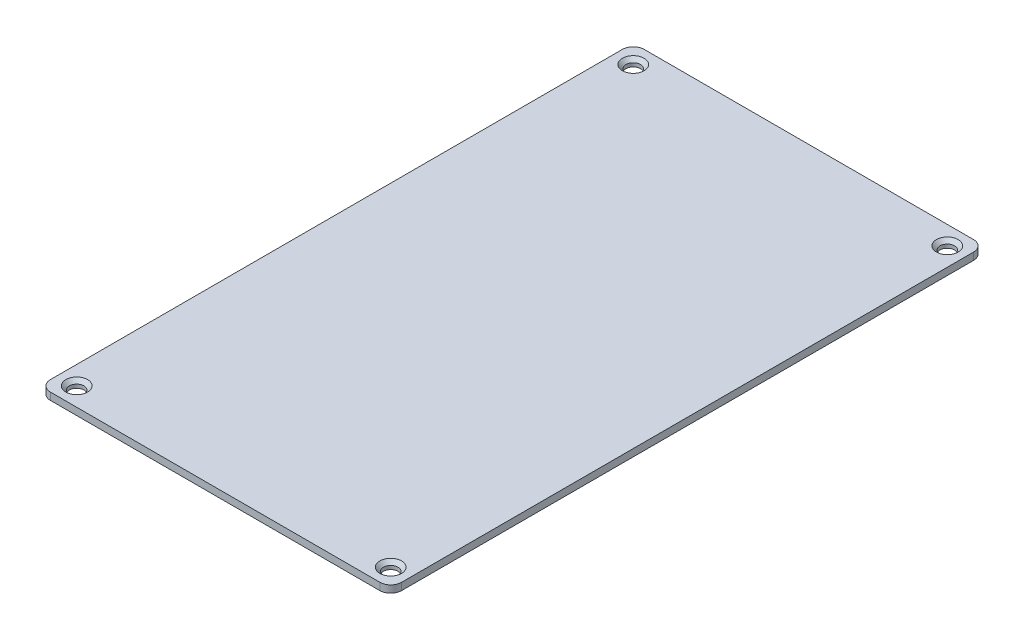
ISO-10303-21;
HEADER;
FILE_DESCRIPTION(('STEP AP214'),'2;1');
FILE_NAME('part.step','',(''),(''),'','','');
FILE_SCHEMA(('AUTOMOTIVE_DESIGN { 1 0 10303 214 1 1 1 1 }'));
ENDSEC;
DATA;
#1=APPLICATION_CONTEXT('core data for automotive mechanical design processes');
#2=APPLICATION_PROTOCOL_DEFINITION('international standard','automotive_design',2000,#1);
#3=PRODUCT_CONTEXT('',#1,'mechanical');
#4=PRODUCT('Part','Part','',(#3));
#5=PRODUCT_RELATED_PRODUCT_CATEGORY('part','',(#4));
#6=PRODUCT_DEFINITION_FORMATION('','',#4);
#7=PRODUCT_DEFINITION_CONTEXT('part definition',#1,'design');
#8=PRODUCT_DEFINITION('design','',#6,#7);
#9=PRODUCT_DEFINITION_SHAPE('','',#8);
#10=(LENGTH_UNIT() NAMED_UNIT(*) SI_UNIT(.MILLI.,.METRE.));
#11=(NAMED_UNIT(*) PLANE_ANGLE_UNIT() SI_UNIT($,.RADIAN.));
#12=(NAMED_UNIT(*) SI_UNIT($,.STERADIAN.) SOLID_ANGLE_UNIT());
#13=UNCERTAINTY_MEASURE_WITH_UNIT(LENGTH_MEASURE(1.E-05),#10,'distance_accuracy_value','');
#14=(GEOMETRIC_REPRESENTATION_CONTEXT(3) GLOBAL_UNCERTAINTY_ASSIGNED_CONTEXT((#13)) GLOBAL_UNIT_ASSIGNED_CONTEXT((#10,
#11,#12)) REPRESENTATION_CONTEXT('',''));
#15=CARTESIAN_POINT('',(0.,0.,0.));
#16=DIRECTION('',(0.,0.,1.));
#17=DIRECTION('',(1.,0.,0.));
#18=AXIS2_PLACEMENT_3D('',#15,#16,#17);
#19=CARTESIAN_POINT('',(-2.,2.,0.));
#20=DIRECTION('',(-1.,0.,0.));
#21=DIRECTION('',(0.,0.,1.));
#22=AXIS2_PLACEMENT_3D('',#19,#20,#21);
#23=PLANE('',#22);
#24=DIRECTION('',(0.,0.,-1.));
#25=VECTOR('',#24,1.);
#26=CARTESIAN_POINT('',(-2.,0.,0.));
#27=LINE('',#26,#25);
#28=CARTESIAN_POINT('',(-2.,0.,-1.));
#29=VERTEX_POINT('',#28);
#30=CARTESIAN_POINT('',(-2.,0.,-159.));
#31=VERTEX_POINT('',#30);
#32=EDGE_CURVE('E149',#29,#31,#27,.T.);
#33=ORIENTED_EDGE('',*,*,#32,.F.);
#34=DIRECTION('',(0.,-1.,0.));
#35=VECTOR('',#34,1.);
#36=CARTESIAN_POINT('',(-2.,2.,-1.));
#37=LINE('',#36,#35);
#38=CARTESIAN_POINT('',(-2.,2.,-1.));
#39=VERTEX_POINT('',#38);
#40=EDGE_CURVE('E198',#29,#39,#37,.F.);
#41=ORIENTED_EDGE('',*,*,#40,.T.);
#42=DIRECTION('',(0.,0.,-1.));
#43=VECTOR('',#42,1.);
#44=CARTESIAN_POINT('',(-2.,2.,0.));
#45=LINE('',#44,#43);
#46=CARTESIAN_POINT('',(-2.,2.,-159.));
#47=VERTEX_POINT('',#46);
#48=EDGE_CURVE('E168',#39,#47,#45,.T.);
#49=ORIENTED_EDGE('',*,*,#48,.T.);
#50=DIRECTION('',(0.,-1.,0.));
#51=VECTOR('',#50,1.);
#52=CARTESIAN_POINT('',(-2.,2.,-159.));
#53=LINE('',#52,#51);
#54=EDGE_CURVE('E194',#47,#31,#53,.T.);
#55=ORIENTED_EDGE('',*,*,#54,.T.);
#56=EDGE_LOOP('',(#33,#41,#49,#55));
#57=FACE_BOUND('',#56,.T.);
#58=ADVANCED_FACE('F43',(#57),#23,.T.);
#59=CARTESIAN_POINT('',(0.,2.,2.));
#60=DIRECTION('',(0.,0.,-1.));
#61=DIRECTION('',(-1.,0.,0.));
#62=AXIS2_PLACEMENT_3D('',#59,#60,#61);
#63=PLANE('',#62);
#64=DIRECTION('',(1.,0.,0.));
#65=VECTOR('',#64,1.);
#66=CARTESIAN_POINT('',(0.,0.,2.));
#67=LINE('',#66,#65);
#68=CARTESIAN_POINT('',(1.,0.,2.));
#69=VERTEX_POINT('',#68);
#70=CARTESIAN_POINT('',(92.,0.,2.));
#71=VERTEX_POINT('',#70);
#72=EDGE_CURVE('E143',#69,#71,#67,.T.);
#73=ORIENTED_EDGE('',*,*,#72,.T.);
#74=DIRECTION('',(0.,-1.,0.));
#75=VECTOR('',#74,1.);
#76=CARTESIAN_POINT('',(92.,2.,2.));
#77=LINE('',#76,#75);
#78=CARTESIAN_POINT('',(92.,2.,2.));
#79=VERTEX_POINT('',#78);
#80=EDGE_CURVE('E117',#71,#79,#77,.F.);
#81=ORIENTED_EDGE('',*,*,#80,.T.);
#82=DIRECTION('',(1.,0.,0.));
#83=VECTOR('',#82,1.);
#84=CARTESIAN_POINT('',(0.,2.,2.));
#85=LINE('',#84,#83);
#86=CARTESIAN_POINT('',(1.,2.,2.));
#87=VERTEX_POINT('',#86);
#88=EDGE_CURVE('E490',#87,#79,#85,.T.);
#89=ORIENTED_EDGE('',*,*,#88,.F.);
#90=DIRECTION('',(0.,-1.,0.));
#91=VECTOR('',#90,1.);
#92=CARTESIAN_POINT('',(1.,0.,2.));
#93=LINE('',#92,#91);
#94=EDGE_CURVE('E123',#87,#69,#93,.T.);
#95=ORIENTED_EDGE('',*,*,#94,.T.);
#96=EDGE_LOOP('',(#73,#81,#89,#95));
#97=FACE_BOUND('',#96,.T.);
#98=ADVANCED_FACE('F252',(#97),#63,.F.);
#99=CARTESIAN_POINT('',(95.,2.,0.));
#100=DIRECTION('',(-1.,0.,0.));
#101=DIRECTION('',(0.,0.,1.));
#102=AXIS2_PLACEMENT_3D('',#99,#100,#101);
#103=PLANE('',#102);
#104=DIRECTION('',(0.,0.,-1.));
#105=VECTOR('',#104,1.);
#106=CARTESIAN_POINT('',(95.,2.,0.));
#107=LINE('',#106,#105);
#108=CARTESIAN_POINT('',(95.,2.,-1.));
#109=VERTEX_POINT('',#108);
#110=CARTESIAN_POINT('',(95.,2.,-159.));
#111=VERTEX_POINT('',#110);
#112=EDGE_CURVE('E132',#109,#111,#107,.T.);
#113=ORIENTED_EDGE('',*,*,#112,.F.);
#114=DIRECTION('',(0.,-1.,0.));
#115=VECTOR('',#114,1.);
#116=CARTESIAN_POINT('',(95.,2.,-1.));
#117=LINE('',#116,#115);
#118=CARTESIAN_POINT('',(95.,0.,-1.));
#119=VERTEX_POINT('',#118);
#120=EDGE_CURVE('E116',#109,#119,#117,.T.);
#121=ORIENTED_EDGE('',*,*,#120,.T.);
#122=DIRECTION('',(0.,0.,-1.));
#123=VECTOR('',#122,1.);
#124=CARTESIAN_POINT('',(95.,0.,0.));
#125=LINE('',#124,#123);
#126=CARTESIAN_POINT('',(95.,0.,-159.));
#127=VERTEX_POINT('',#126);
#128=EDGE_CURVE('E130',#119,#127,#125,.T.);
#129=ORIENTED_EDGE('',*,*,#128,.T.);
#130=DIRECTION('',(0.,-1.,0.));
#131=VECTOR('',#130,1.);
#132=CARTESIAN_POINT('',(95.,2.,-159.));
#133=LINE('',#132,#131);
#134=EDGE_CURVE('E135',#127,#111,#133,.F.);
#135=ORIENTED_EDGE('',*,*,#134,.T.);
#136=EDGE_LOOP('',(#113,#121,#129,#135));
#137=FACE_BOUND('',#136,.T.);
#138=ADVANCED_FACE('F129',(#137),#103,.F.);
#139=CARTESIAN_POINT('',(3.1210255500278,2.,-3.1210255500278));
#140=DIRECTION('',(0.,-1.,0.));
#141=DIRECTION('',(0.,0.,-1.));
#142=AXIS2_PLACEMENT_3D('',#139,#140,#141);
#143=CYLINDRICAL_SURFACE('',#142,2.);
#144=CARTESIAN_POINT('',(3.1210255500278,0.999999999999991,-3.1210255500278));
#145=DIRECTION('',(0.,1.,0.));
#146=DIRECTION('',(0.,0.,1.));
#147=AXIS2_PLACEMENT_3D('',#144,#145,#146);
#148=CIRCLE('',#147,2.);
#149=CARTESIAN_POINT('',(3.1210255500278,0.999999999999991,-1.1210255500278));
#150=VERTEX_POINT('',#149);
#151=EDGE_CURVE('E53',#150,#150,#148,.T.);
#152=ORIENTED_EDGE('',*,*,#151,.T.);
#153=EDGE_LOOP('',(#152));
#154=FACE_BOUND('',#153,.T.);
#155=CARTESIAN_POINT('',(3.1210255500278,0.,-3.1210255500278));
#156=DIRECTION('',(0.,1.,0.));
#157=DIRECTION('',(0.,0.,1.));
#158=AXIS2_PLACEMENT_3D('',#155,#156,#157);
#159=CIRCLE('',#158,2.);
#160=CARTESIAN_POINT('',(3.1210255500278,0.,-1.1210255500278));
#161=VERTEX_POINT('',#160);
#162=EDGE_CURVE('E160',#161,#161,#159,.T.);
#163=ORIENTED_EDGE('',*,*,#162,.F.);
#164=EDGE_LOOP('',(#163));
#165=FACE_BOUND('',#164,.T.);
#166=ADVANCED_FACE('F234',(#154,#165),#143,.F.);
#167=CARTESIAN_POINT('',(89.8789744499722,2.,-3.1210255500278));
#168=DIRECTION('',(0.,-1.,0.));
#169=DIRECTION('',(0.,0.,-1.));
#170=AXIS2_PLACEMENT_3D('',#167,#168,#169);
#171=CYLINDRICAL_SURFACE('',#170,2.);
#172=CARTESIAN_POINT('',(89.8789744499722,1.,-3.1210255500278));
#173=DIRECTION('',(0.,1.,0.));
#174=DIRECTION('',(0.,0.,1.));
#175=AXIS2_PLACEMENT_3D('',#172,#173,#174);
#176=CIRCLE('',#175,2.);
#177=CARTESIAN_POINT('',(89.8789744499722,1.,-1.1210255500278));
#178=VERTEX_POINT('',#177);
#179=EDGE_CURVE('E11',#178,#178,#176,.T.);
#180=ORIENTED_EDGE('',*,*,#179,.T.);
#181=EDGE_LOOP('',(#180));
#182=FACE_BOUND('',#181,.T.);
#183=CARTESIAN_POINT('',(89.8789744499722,0.,-3.1210255500278));
#184=DIRECTION('',(0.,1.,0.));
#185=DIRECTION('',(0.,0.,1.));
#186=AXIS2_PLACEMENT_3D('',#183,#184,#185);
#187=CIRCLE('',#186,2.);
#188=CARTESIAN_POINT('',(89.8789744499722,0.,-1.1210255500278));
#189=VERTEX_POINT('',#188);
#190=EDGE_CURVE('E156',#189,#189,#187,.F.);
#191=ORIENTED_EDGE('',*,*,#190,.T.);
#192=EDGE_LOOP('',(#191));
#193=FACE_BOUND('',#192,.T.);
#194=ADVANCED_FACE('F299',(#182,#193),#171,.F.);
#195=CARTESIAN_POINT('',(89.8789744499721,2.,-156.878974449972));
#196=DIRECTION('',(0.,-1.,0.));
#197=DIRECTION('',(0.,0.,-1.));
#198=AXIS2_PLACEMENT_3D('',#195,#196,#197);
#199=CYLINDRICAL_SURFACE('',#198,2.);
#200=CARTESIAN_POINT('',(89.8789744499721,0.999999999999987,-156.878974449972));
#201=DIRECTION('',(0.,1.,0.));
#202=DIRECTION('',(0.,0.,1.));
#203=AXIS2_PLACEMENT_3D('',#200,#201,#202);
#204=CIRCLE('',#203,2.);
#205=CARTESIAN_POINT('',(89.8789744499721,0.999999999999987,-154.878974449972));
#206=VERTEX_POINT('',#205);
#207=EDGE_CURVE('E207',#206,#206,#204,.T.);
#208=ORIENTED_EDGE('',*,*,#207,.T.);
#209=EDGE_LOOP('',(#208));
#210=FACE_BOUND('',#209,.T.);
#211=CARTESIAN_POINT('',(89.8789744499721,0.,-156.878974449972));
#212=DIRECTION('',(0.,1.,0.));
#213=DIRECTION('',(0.,0.,1.));
#214=AXIS2_PLACEMENT_3D('',#211,#212,#213);
#215=CIRCLE('',#214,2.);
#216=CARTESIAN_POINT('',(89.8789744499721,0.,-154.878974449972));
#217=VERTEX_POINT('',#216);
#218=EDGE_CURVE('E147',#217,#217,#215,.T.);
#219=ORIENTED_EDGE('',*,*,#218,.F.);
#220=EDGE_LOOP('',(#219));
#221=FACE_BOUND('',#220,.T.);
#222=ADVANCED_FACE('F295',(#210,#221),#199,.F.);
#223=CARTESIAN_POINT('',(0.,2.,-162.));
#224=DIRECTION('',(0.,0.,-1.));
#225=DIRECTION('',(-1.,0.,0.));
#226=AXIS2_PLACEMENT_3D('',#223,#224,#225);
#227=PLANE('',#226);
#228=DIRECTION('',(1.,0.,0.));
#229=VECTOR('',#228,1.);
#230=CARTESIAN_POINT('',(0.,2.,-162.));
#231=LINE('',#230,#229);
#232=CARTESIAN_POINT('',(1.,2.,-162.));
#233=VERTEX_POINT('',#232);
#234=CARTESIAN_POINT('',(92.,2.,-162.));
#235=VERTEX_POINT('',#234);
#236=EDGE_CURVE('E170',#233,#235,#231,.T.);
#237=ORIENTED_EDGE('',*,*,#236,.T.);
#238=DIRECTION('',(0.,-1.,0.));
#239=VECTOR('',#238,1.);
#240=CARTESIAN_POINT('',(92.,0.,-162.));
#241=LINE('',#240,#239);
#242=CARTESIAN_POINT('',(92.,0.,-162.));
#243=VERTEX_POINT('',#242);
#244=EDGE_CURVE('E203',#235,#243,#241,.T.);
#245=ORIENTED_EDGE('',*,*,#244,.T.);
#246=DIRECTION('',(1.,0.,0.));
#247=VECTOR('',#246,1.);
#248=CARTESIAN_POINT('',(0.,0.,-162.));
#249=LINE('',#248,#247);
#250=CARTESIAN_POINT('',(1.,0.,-162.));
#251=VERTEX_POINT('',#250);
#252=EDGE_CURVE('E142',#251,#243,#249,.T.);
#253=ORIENTED_EDGE('',*,*,#252,.F.);
#254=DIRECTION('',(0.,-1.,0.));
#255=VECTOR('',#254,1.);
#256=CARTESIAN_POINT('',(1.,2.,-162.));
#257=LINE('',#256,#255);
#258=EDGE_CURVE('E67',#251,#233,#257,.F.);
#259=ORIENTED_EDGE('',*,*,#258,.T.);
#260=EDGE_LOOP('',(#237,#245,#253,#259));
#261=FACE_BOUND('',#260,.T.);
#262=ADVANCED_FACE('F298',(#261),#227,.T.);
#263=CARTESIAN_POINT('',(3.12102555002776,2.,-156.878974449972));
#264=DIRECTION('',(0.,-1.,0.));
#265=DIRECTION('',(0.,0.,-1.));
#266=AXIS2_PLACEMENT_3D('',#263,#264,#265);
#267=CYLINDRICAL_SURFACE('',#266,2.);
#268=CARTESIAN_POINT('',(3.12102555002776,1.00000000000005,-156.878974449972));
#269=DIRECTION('',(0.,1.,0.));
#270=DIRECTION('',(0.,0.,1.));
#271=AXIS2_PLACEMENT_3D('',#268,#269,#270);
#272=CIRCLE('',#271,2.);
#273=CARTESIAN_POINT('',(3.12102555002776,1.00000000000005,-154.878974449972));
#274=VERTEX_POINT('',#273);
#275=EDGE_CURVE('E227',#274,#274,#272,.T.);
#276=ORIENTED_EDGE('',*,*,#275,.T.);
#277=EDGE_LOOP('',(#276));
#278=FACE_BOUND('',#277,.T.);
#279=CARTESIAN_POINT('',(3.12102555002776,0.,-156.878974449972));
#280=DIRECTION('',(0.,1.,0.));
#281=DIRECTION('',(0.,0.,1.));
#282=AXIS2_PLACEMENT_3D('',#279,#280,#281);
#283=CIRCLE('',#282,2.);
#284=CARTESIAN_POINT('',(3.12102555002776,0.,-154.878974449972));
#285=VERTEX_POINT('',#284);
#286=EDGE_CURVE('E164',#285,#285,#283,.F.);
#287=ORIENTED_EDGE('',*,*,#286,.T.);
#288=EDGE_LOOP('',(#287));
#289=FACE_BOUND('',#288,.T.);
#290=ADVANCED_FACE('F312',(#278,#289),#267,.F.);
#291=CARTESIAN_POINT('',(0.,2.,0.));
#292=DIRECTION('',(0.,1.,0.));
#293=DIRECTION('',(0.,0.,1.));
#294=AXIS2_PLACEMENT_3D('',#291,#292,#293);
#295=PLANE('',#294);
#296=CARTESIAN_POINT('',(89.8789744499721,2.,-156.878974449972));
#297=DIRECTION('',(0.,1.,0.));
#298=DIRECTION('',(0.,0.,1.));
#299=AXIS2_PLACEMENT_3D('',#296,#297,#298);
#300=CIRCLE('',#299,3.);
#301=CARTESIAN_POINT('',(89.8789744499721,2.,-153.878974449972));
#302=VERTEX_POINT('',#301);
#303=EDGE_CURVE('E223',#302,#302,#300,.F.);
#304=ORIENTED_EDGE('',*,*,#303,.T.);
#305=EDGE_LOOP('',(#304));
#306=FACE_BOUND('',#305,.T.);
#307=CARTESIAN_POINT('',(3.12102555002776,2.,-156.878974449972));
#308=DIRECTION('',(0.,1.,0.));
#309=DIRECTION('',(0.,0.,1.));
#310=AXIS2_PLACEMENT_3D('',#307,#308,#309);
#311=CIRCLE('',#310,2.99999999999998);
#312=CARTESIAN_POINT('',(3.12102555002776,2.,-153.878974449972));
#313=VERTEX_POINT('',#312);
#314=EDGE_CURVE('E219',#313,#313,#311,.F.);
#315=ORIENTED_EDGE('',*,*,#314,.T.);
#316=EDGE_LOOP('',(#315));
#317=FACE_BOUND('',#316,.T.);
#318=CARTESIAN_POINT('',(3.1210255500278,2.,-3.1210255500278));
#319=DIRECTION('',(0.,1.,0.));
#320=DIRECTION('',(0.,0.,1.));
#321=AXIS2_PLACEMENT_3D('',#318,#319,#320);
#322=CIRCLE('',#321,3.);
#323=CARTESIAN_POINT('',(3.1210255500278,2.,-0.121025550027796));
#324=VERTEX_POINT('',#323);
#325=EDGE_CURVE('E215',#324,#324,#322,.F.);
#326=ORIENTED_EDGE('',*,*,#325,.T.);
#327=EDGE_LOOP('',(#326));
#328=FACE_BOUND('',#327,.T.);
#329=CARTESIAN_POINT('',(89.8789744499722,2.,-3.1210255500278));
#330=DIRECTION('',(0.,1.,0.));
#331=DIRECTION('',(0.,0.,1.));
#332=AXIS2_PLACEMENT_3D('',#329,#330,#331);
#333=CIRCLE('',#332,2.99999999999997);
#334=CARTESIAN_POINT('',(89.8789744499722,2.,-0.121025550027825));
#335=VERTEX_POINT('',#334);
#336=EDGE_CURVE('E211',#335,#335,#333,.F.);
#337=ORIENTED_EDGE('',*,*,#336,.T.);
#338=EDGE_LOOP('',(#337));
#339=FACE_BOUND('',#338,.T.);
#340=ORIENTED_EDGE('',*,*,#88,.T.);
#341=CARTESIAN_POINT('',(92.,2.,-1.));
#342=DIRECTION('',(0.,1.,0.));
#343=DIRECTION('',(0.,0.,1.));
#344=AXIS2_PLACEMENT_3D('',#341,#342,#343);
#345=CIRCLE('',#344,3.);
#346=EDGE_CURVE('E191',#79,#109,#345,.T.);
#347=ORIENTED_EDGE('',*,*,#346,.T.);
#348=ORIENTED_EDGE('',*,*,#112,.T.);
#349=CARTESIAN_POINT('',(92.,2.,-159.));
#350=DIRECTION('',(0.,1.,0.));
#351=DIRECTION('',(0.,0.,1.));
#352=AXIS2_PLACEMENT_3D('',#349,#350,#351);
#353=CIRCLE('',#352,3.);
#354=EDGE_CURVE('E60',#111,#235,#353,.T.);
#355=ORIENTED_EDGE('',*,*,#354,.T.);
#356=ORIENTED_EDGE('',*,*,#236,.F.);
#357=CARTESIAN_POINT('',(1.,2.,-159.));
#358=DIRECTION('',(0.,1.,0.));
#359=DIRECTION('',(0.,0.,1.));
#360=AXIS2_PLACEMENT_3D('',#357,#358,#359);
#361=CIRCLE('',#360,3.);
#362=EDGE_CURVE('E183',#233,#47,#361,.T.);
#363=ORIENTED_EDGE('',*,*,#362,.T.);
#364=ORIENTED_EDGE('',*,*,#48,.F.);
#365=CARTESIAN_POINT('',(1.,2.,-1.));
#366=DIRECTION('',(0.,1.,0.));
#367=DIRECTION('',(0.,0.,1.));
#368=AXIS2_PLACEMENT_3D('',#365,#366,#367);
#369=CIRCLE('',#368,3.);
#370=EDGE_CURVE('E188',#39,#87,#369,.T.);
#371=ORIENTED_EDGE('',*,*,#370,.T.);
#372=EDGE_LOOP('',(#340,#347,#348,#355,#356,#363,#364,#371));
#373=FACE_BOUND('',#372,.T.);
#374=ADVANCED_FACE('F304',(#306,#317,#328,#339,#373),#295,.T.);
#375=CARTESIAN_POINT('',(0.,0.,0.));
#376=DIRECTION('',(0.,1.,0.));
#377=DIRECTION('',(0.,0.,1.));
#378=AXIS2_PLACEMENT_3D('',#375,#376,#377);
#379=PLANE('',#378);
#380=ORIENTED_EDGE('',*,*,#128,.F.);
#381=CARTESIAN_POINT('',(92.,0.,-1.));
#382=DIRECTION('',(0.,1.,0.));
#383=DIRECTION('',(0.,0.,1.));
#384=AXIS2_PLACEMENT_3D('',#381,#382,#383);
#385=CIRCLE('',#384,3.);
#386=EDGE_CURVE('E112',#119,#71,#385,.F.);
#387=ORIENTED_EDGE('',*,*,#386,.T.);
#388=ORIENTED_EDGE('',*,*,#72,.F.);
#389=CARTESIAN_POINT('',(1.,0.,-1.));
#390=DIRECTION('',(0.,1.,0.));
#391=DIRECTION('',(0.,0.,1.));
#392=AXIS2_PLACEMENT_3D('',#389,#390,#391);
#393=CIRCLE('',#392,3.);
#394=EDGE_CURVE('E124',#69,#29,#393,.F.);
#395=ORIENTED_EDGE('',*,*,#394,.T.);
#396=ORIENTED_EDGE('',*,*,#32,.T.);
#397=CARTESIAN_POINT('',(1.,0.,-159.));
#398=DIRECTION('',(0.,1.,0.));
#399=DIRECTION('',(0.,0.,1.));
#400=AXIS2_PLACEMENT_3D('',#397,#398,#399);
#401=CIRCLE('',#400,3.);
#402=EDGE_CURVE('E134',#31,#251,#401,.F.);
#403=ORIENTED_EDGE('',*,*,#402,.T.);
#404=ORIENTED_EDGE('',*,*,#252,.T.);
#405=CARTESIAN_POINT('',(92.,0.,-159.));
#406=DIRECTION('',(0.,1.,0.));
#407=DIRECTION('',(0.,0.,1.));
#408=AXIS2_PLACEMENT_3D('',#405,#406,#407);
#409=CIRCLE('',#408,3.);
#410=EDGE_CURVE('E140',#243,#127,#409,.F.);
#411=ORIENTED_EDGE('',*,*,#410,.T.);
#412=EDGE_LOOP('',(#380,#387,#388,#395,#396,#403,#404,#411));
#413=FACE_BOUND('',#412,.T.);
#414=ORIENTED_EDGE('',*,*,#218,.T.);
#415=EDGE_LOOP('',(#414));
#416=FACE_BOUND('',#415,.T.);
#417=ORIENTED_EDGE('',*,*,#190,.F.);
#418=EDGE_LOOP('',(#417));
#419=FACE_BOUND('',#418,.T.);
#420=ORIENTED_EDGE('',*,*,#162,.T.);
#421=EDGE_LOOP('',(#420));
#422=FACE_BOUND('',#421,.T.);
#423=ORIENTED_EDGE('',*,*,#286,.F.);
#424=EDGE_LOOP('',(#423));
#425=FACE_BOUND('',#424,.T.);
#426=ADVANCED_FACE('F137',(#413,#416,#419,#422,#425),#379,.F.);
#427=CARTESIAN_POINT('',(92.,2.,-1.));
#428=DIRECTION('',(0.,-1.,0.));
#429=DIRECTION('',(0.,0.,-1.));
#430=AXIS2_PLACEMENT_3D('',#427,#428,#429);
#431=CYLINDRICAL_SURFACE('',#430,3.);
#432=ORIENTED_EDGE('',*,*,#346,.F.);
#433=ORIENTED_EDGE('',*,*,#80,.F.);
#434=ORIENTED_EDGE('',*,*,#386,.F.);
#435=ORIENTED_EDGE('',*,*,#120,.F.);
#436=EDGE_LOOP('',(#432,#433,#434,#435));
#437=FACE_BOUND('',#436,.T.);
#438=ADVANCED_FACE('F115',(#437),#431,.T.);
#439=CARTESIAN_POINT('',(1.,2.,-1.));
#440=DIRECTION('',(0.,1.,0.));
#441=DIRECTION('',(0.,0.,1.));
#442=AXIS2_PLACEMENT_3D('',#439,#440,#441);
#443=CYLINDRICAL_SURFACE('',#442,3.);
#444=ORIENTED_EDGE('',*,*,#370,.F.);
#445=ORIENTED_EDGE('',*,*,#40,.F.);
#446=ORIENTED_EDGE('',*,*,#394,.F.);
#447=ORIENTED_EDGE('',*,*,#94,.F.);
#448=EDGE_LOOP('',(#444,#445,#446,#447));
#449=FACE_BOUND('',#448,.T.);
#450=ADVANCED_FACE('F265',(#449),#443,.T.);
#451=CARTESIAN_POINT('',(92.,2.,-159.));
#452=DIRECTION('',(0.,1.,0.));
#453=DIRECTION('',(0.,0.,1.));
#454=AXIS2_PLACEMENT_3D('',#451,#452,#453);
#455=CYLINDRICAL_SURFACE('',#454,3.);
#456=ORIENTED_EDGE('',*,*,#354,.F.);
#457=ORIENTED_EDGE('',*,*,#134,.F.);
#458=ORIENTED_EDGE('',*,*,#410,.F.);
#459=ORIENTED_EDGE('',*,*,#244,.F.);
#460=EDGE_LOOP('',(#456,#457,#458,#459));
#461=FACE_BOUND('',#460,.T.);
#462=ADVANCED_FACE('F268',(#461),#455,.T.);
#463=CARTESIAN_POINT('',(1.,2.,-159.));
#464=DIRECTION('',(0.,-1.,0.));
#465=DIRECTION('',(0.,0.,-1.));
#466=AXIS2_PLACEMENT_3D('',#463,#464,#465);
#467=CYLINDRICAL_SURFACE('',#466,3.);
#468=ORIENTED_EDGE('',*,*,#362,.F.);
#469=ORIENTED_EDGE('',*,*,#258,.F.);
#470=ORIENTED_EDGE('',*,*,#402,.F.);
#471=ORIENTED_EDGE('',*,*,#54,.F.);
#472=EDGE_LOOP('',(#468,#469,#470,#471));
#473=FACE_BOUND('',#472,.T.);
#474=ADVANCED_FACE('F272',(#473),#467,.T.);
#475=CARTESIAN_POINT('',(89.8789744499721,0.999999999999987,-156.878974449972));
#476=DIRECTION('',(0.,1.,0.));
#477=DIRECTION('',(0.,0.,1.));
#478=AXIS2_PLACEMENT_3D('',#475,#476,#477);
#479=CONICAL_SURFACE('',#478,2.,0.785398163397445);
#480=ORIENTED_EDGE('',*,*,#303,.F.);
#481=EDGE_LOOP('',(#480));
#482=FACE_BOUND('',#481,.T.);
#483=ORIENTED_EDGE('',*,*,#207,.F.);
#484=EDGE_LOOP('',(#483));
#485=FACE_BOUND('',#484,.T.);
#486=ADVANCED_FACE('F246',(#482,#485),#479,.F.);
#487=CARTESIAN_POINT('',(3.12102555002776,2.,-156.878974449972));
#488=DIRECTION('',(0.,1.,0.));
#489=DIRECTION('',(0.,0.,1.));
#490=AXIS2_PLACEMENT_3D('',#487,#488,#489);
#491=CONICAL_SURFACE('',#490,2.99999999999998,0.785398163397459);
#492=ORIENTED_EDGE('',*,*,#275,.F.);
#493=EDGE_LOOP('',(#492));
#494=FACE_BOUND('',#493,.T.);
#495=ORIENTED_EDGE('',*,*,#314,.F.);
#496=EDGE_LOOP('',(#495));
#497=FACE_BOUND('',#496,.T.);
#498=ADVANCED_FACE('F239',(#494,#497),#491,.F.);
#499=CARTESIAN_POINT('',(3.1210255500278,0.999999999999991,-3.1210255500278));
#500=DIRECTION('',(0.,1.,0.));
#501=DIRECTION('',(0.,0.,1.));
#502=AXIS2_PLACEMENT_3D('',#499,#500,#501);
#503=CONICAL_SURFACE('',#502,2.,0.785398163397445);
#504=ORIENTED_EDGE('',*,*,#325,.F.);
#505=EDGE_LOOP('',(#504));
#506=FACE_BOUND('',#505,.T.);
#507=ORIENTED_EDGE('',*,*,#151,.F.);
#508=EDGE_LOOP('',(#507));
#509=FACE_BOUND('',#508,.T.);
#510=ADVANCED_FACE('F237',(#506,#509),#503,.F.);
#511=CARTESIAN_POINT('',(89.8789744499722,2.,-3.1210255500278));
#512=DIRECTION('',(0.,1.,0.));
#513=DIRECTION('',(0.,0.,1.));
#514=AXIS2_PLACEMENT_3D('',#511,#512,#513);
#515=CONICAL_SURFACE('',#514,2.99999999999997,0.785398163397438);
#516=ORIENTED_EDGE('',*,*,#179,.F.);
#517=EDGE_LOOP('',(#516));
#518=FACE_BOUND('',#517,.T.);
#519=ORIENTED_EDGE('',*,*,#336,.F.);
#520=EDGE_LOOP('',(#519));
#521=FACE_BOUND('',#520,.T.);
#522=ADVANCED_FACE('F46',(#518,#521),#515,.F.);
#523=CLOSED_SHELL('',(#58,#98,#138,#166,#194,#222,#262,#290,#374,#426,#438,#450,#462,#474,#486,
#498,#510,#522));
#524=MANIFOLD_SOLID_BREP('B2',#523);
#525=ADVANCED_BREP_SHAPE_REPRESENTATION('',(#18,#524),#14);
#526=SHAPE_DEFINITION_REPRESENTATION(#9,#525);
ENDSEC;
END-ISO-10303-21;
